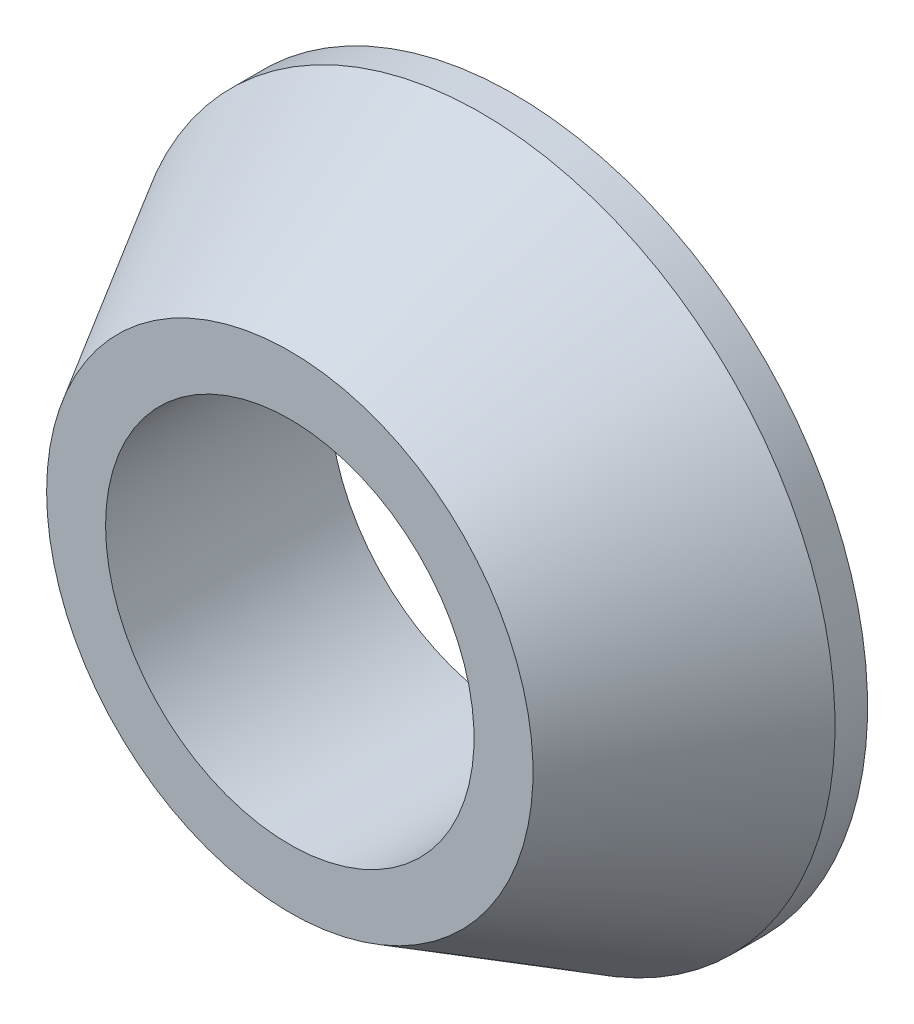
ISO-10303-21;
HEADER;
FILE_DESCRIPTION(('STEP AP214'),'2;1');
FILE_NAME('part.step','',(''),(''),'','','');
FILE_SCHEMA(('AUTOMOTIVE_DESIGN { 1 0 10303 214 1 1 1 1 }'));
ENDSEC;
DATA;
#1=APPLICATION_CONTEXT('core data for automotive mechanical design processes');
#2=APPLICATION_PROTOCOL_DEFINITION('international standard','automotive_design',2000,#1);
#3=PRODUCT_CONTEXT('',#1,'mechanical');
#4=PRODUCT('Part','Part','',(#3));
#5=PRODUCT_RELATED_PRODUCT_CATEGORY('part','',(#4));
#6=PRODUCT_DEFINITION_FORMATION('','',#4);
#7=PRODUCT_DEFINITION_CONTEXT('part definition',#1,'design');
#8=PRODUCT_DEFINITION('design','',#6,#7);
#9=PRODUCT_DEFINITION_SHAPE('','',#8);
#10=(LENGTH_UNIT() NAMED_UNIT(*) SI_UNIT(.MILLI.,.METRE.));
#11=(NAMED_UNIT(*) PLANE_ANGLE_UNIT() SI_UNIT($,.RADIAN.));
#12=(NAMED_UNIT(*) SI_UNIT($,.STERADIAN.) SOLID_ANGLE_UNIT());
#13=UNCERTAINTY_MEASURE_WITH_UNIT(LENGTH_MEASURE(1.E-05),#10,'distance_accuracy_value','');
#14=(GEOMETRIC_REPRESENTATION_CONTEXT(3) GLOBAL_UNCERTAINTY_ASSIGNED_CONTEXT((#13)) GLOBAL_UNIT_ASSIGNED_CONTEXT((#10,
#11,#12)) REPRESENTATION_CONTEXT('',''));
#15=CARTESIAN_POINT('',(0.,0.,0.));
#16=DIRECTION('',(0.,0.,1.));
#17=DIRECTION('',(1.,0.,0.));
#18=AXIS2_PLACEMENT_3D('',#15,#16,#17);
#19=CARTESIAN_POINT('',(0.,5.23875,4.826));
#20=DIRECTION('',(0.,0.,1.));
#21=DIRECTION('',(1.,0.,0.));
#22=AXIS2_PLACEMENT_3D('',#19,#20,#21);
#23=PLANE('',#22);
#24=CARTESIAN_POINT('',(0.,0.,4.826));
#25=DIRECTION('',(0.,0.,-1.));
#26=DIRECTION('',(-1.,0.,0.));
#27=AXIS2_PLACEMENT_3D('',#24,#25,#26);
#28=CIRCLE('',#27,3.96875);
#29=CARTESIAN_POINT('',(-3.96875,0.,4.826));
#30=VERTEX_POINT('',#29);
#31=EDGE_CURVE('E10',#30,#30,#28,.T.);
#32=ORIENTED_EDGE('',*,*,#31,.T.);
#33=EDGE_LOOP('',(#32));
#34=FACE_BOUND('',#33,.T.);
#35=CARTESIAN_POINT('',(0.,0.,4.826));
#36=DIRECTION('',(0.,0.,-1.));
#37=DIRECTION('',(-1.,0.,0.));
#38=AXIS2_PLACEMENT_3D('',#35,#36,#37);
#39=CIRCLE('',#38,5.23875);
#40=CARTESIAN_POINT('',(-5.23875,0.,4.826));
#41=VERTEX_POINT('',#40);
#42=EDGE_CURVE('E60',#41,#41,#39,.T.);
#43=ORIENTED_EDGE('',*,*,#42,.F.);
#44=EDGE_LOOP('',(#43));
#45=FACE_BOUND('',#44,.T.);
#46=ADVANCED_FACE('F41',(#34,#45),#23,.T.);
#47=CARTESIAN_POINT('',(0.,0.,0.));
#48=DIRECTION('',(0.,0.,-1.));
#49=DIRECTION('',(-1.,0.,0.));
#50=AXIS2_PLACEMENT_3D('',#47,#48,#49);
#51=CYLINDRICAL_SURFACE('',#50,3.96875);
#52=CARTESIAN_POINT('',(0.,0.,0.));
#53=DIRECTION('',(0.,0.,-1.));
#54=DIRECTION('',(-1.,0.,0.));
#55=AXIS2_PLACEMENT_3D('',#52,#53,#54);
#56=CIRCLE('',#55,3.96875);
#57=CARTESIAN_POINT('',(-3.96875,0.,0.));
#58=VERTEX_POINT('',#57);
#59=EDGE_CURVE('E47',#58,#58,#56,.T.);
#60=ORIENTED_EDGE('',*,*,#59,.T.);
#61=EDGE_LOOP('',(#60));
#62=FACE_BOUND('',#61,.T.);
#63=ORIENTED_EDGE('',*,*,#31,.F.);
#64=EDGE_LOOP('',(#63));
#65=FACE_BOUND('',#64,.T.);
#66=ADVANCED_FACE('F68',(#62,#65),#51,.F.);
#67=CARTESIAN_POINT('',(0.,3.96875,0.));
#68=DIRECTION('',(0.,0.,-1.));
#69=DIRECTION('',(-1.,0.,0.));
#70=AXIS2_PLACEMENT_3D('',#67,#68,#69);
#71=PLANE('',#70);
#72=CARTESIAN_POINT('',(0.,0.,0.));
#73=DIRECTION('',(0.,0.,-1.));
#74=DIRECTION('',(-1.,0.,0.));
#75=AXIS2_PLACEMENT_3D('',#72,#73,#74);
#76=CIRCLE('',#75,7.62);
#77=CARTESIAN_POINT('',(-7.62,0.,0.));
#78=VERTEX_POINT('',#77);
#79=EDGE_CURVE('E51',#78,#78,#76,.T.);
#80=ORIENTED_EDGE('',*,*,#79,.T.);
#81=EDGE_LOOP('',(#80));
#82=FACE_BOUND('',#81,.T.);
#83=ORIENTED_EDGE('',*,*,#59,.F.);
#84=EDGE_LOOP('',(#83));
#85=FACE_BOUND('',#84,.T.);
#86=ADVANCED_FACE('F72',(#82,#85),#71,.T.);
#87=CARTESIAN_POINT('',(0.,0.,0.));
#88=DIRECTION('',(0.,0.,-1.));
#89=DIRECTION('',(-1.,0.,0.));
#90=AXIS2_PLACEMENT_3D('',#87,#88,#89);
#91=CYLINDRICAL_SURFACE('',#90,7.62);
#92=CARTESIAN_POINT('',(0.,0.,0.70155401447656));
#93=DIRECTION('',(0.,0.,-1.));
#94=DIRECTION('',(-1.,0.,0.));
#95=AXIS2_PLACEMENT_3D('',#92,#93,#94);
#96=CIRCLE('',#95,7.62);
#97=CARTESIAN_POINT('',(-7.62,0.,0.70155401447656));
#98=VERTEX_POINT('',#97);
#99=EDGE_CURVE('E55',#98,#98,#96,.T.);
#100=ORIENTED_EDGE('',*,*,#99,.T.);
#101=EDGE_LOOP('',(#100));
#102=FACE_BOUND('',#101,.T.);
#103=ORIENTED_EDGE('',*,*,#79,.F.);
#104=EDGE_LOOP('',(#103));
#105=FACE_BOUND('',#104,.T.);
#106=ADVANCED_FACE('F76',(#102,#105),#91,.T.);
#107=CARTESIAN_POINT('',(0.,0.,0.70155401447656));
#108=DIRECTION('',(0.,0.,-1.));
#109=DIRECTION('',(-1.,0.,0.));
#110=AXIS2_PLACEMENT_3D('',#107,#108,#109);
#111=CONICAL_SURFACE('',#110,7.62,0.523598775598293);
#112=ORIENTED_EDGE('',*,*,#42,.T.);
#113=EDGE_LOOP('',(#112));
#114=FACE_BOUND('',#113,.T.);
#115=ORIENTED_EDGE('',*,*,#99,.F.);
#116=EDGE_LOOP('',(#115));
#117=FACE_BOUND('',#116,.T.);
#118=ADVANCED_FACE('F64',(#114,#117),#111,.T.);
#119=CLOSED_SHELL('',(#46,#66,#86,#106,#118));
#120=MANIFOLD_SOLID_BREP('B2',#119);
#121=ADVANCED_BREP_SHAPE_REPRESENTATION('',(#18,#120),#14);
#122=SHAPE_DEFINITION_REPRESENTATION(#9,#121);
ENDSEC;
END-ISO-10303-21;
